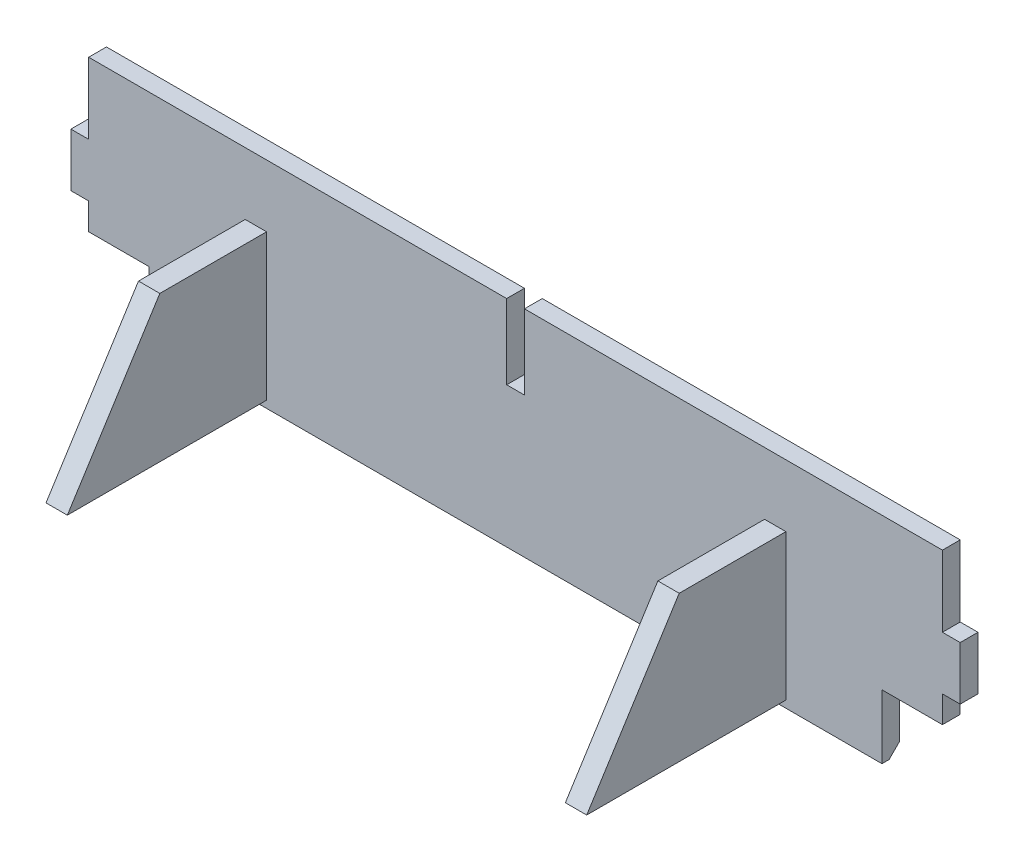
ISO-10303-21;
HEADER;
FILE_DESCRIPTION(('STEP AP214'),'2;1');
FILE_NAME('part.step','',(''),(''),'','','');
FILE_SCHEMA(('AUTOMOTIVE_DESIGN { 1 0 10303 214 1 1 1 1 }'));
ENDSEC;
DATA;
#1=APPLICATION_CONTEXT('core data for automotive mechanical design processes');
#2=APPLICATION_PROTOCOL_DEFINITION('international standard','automotive_design',2000,#1);
#3=PRODUCT_CONTEXT('',#1,'mechanical');
#4=PRODUCT('Part','Part','',(#3));
#5=PRODUCT_RELATED_PRODUCT_CATEGORY('part','',(#4));
#6=PRODUCT_DEFINITION_FORMATION('','',#4);
#7=PRODUCT_DEFINITION_CONTEXT('part definition',#1,'design');
#8=PRODUCT_DEFINITION('design','',#6,#7);
#9=PRODUCT_DEFINITION_SHAPE('','',#8);
#10=(LENGTH_UNIT() NAMED_UNIT(*) SI_UNIT(.MILLI.,.METRE.));
#11=(NAMED_UNIT(*) PLANE_ANGLE_UNIT() SI_UNIT($,.RADIAN.));
#12=(NAMED_UNIT(*) SI_UNIT($,.STERADIAN.) SOLID_ANGLE_UNIT());
#13=UNCERTAINTY_MEASURE_WITH_UNIT(LENGTH_MEASURE(1.E-05),#10,'distance_accuracy_value','');
#14=(GEOMETRIC_REPRESENTATION_CONTEXT(3) GLOBAL_UNCERTAINTY_ASSIGNED_CONTEXT((#13)) GLOBAL_UNIT_ASSIGNED_CONTEXT((#10,
#11,#12)) REPRESENTATION_CONTEXT('',''));
#15=CARTESIAN_POINT('',(0.,0.,0.));
#16=DIRECTION('',(0.,0.,1.));
#17=DIRECTION('',(1.,0.,0.));
#18=AXIS2_PLACEMENT_3D('',#15,#16,#17);
#19=CARTESIAN_POINT('',(0.,0.,5.));
#20=DIRECTION('',(0.,0.,1.));
#21=DIRECTION('',(1.,0.,0.));
#22=AXIS2_PLACEMENT_3D('',#19,#20,#21);
#23=PLANE('',#22);
#24=DIRECTION('',(1.,0.,0.));
#25=VECTOR('',#24,1.);
#26=CARTESIAN_POINT('',(0.,0.,5.));
#27=LINE('',#26,#25);
#28=CARTESIAN_POINT('',(17.,0.,5.));
#29=VERTEX_POINT('',#28);
#30=CARTESIAN_POINT('',(223.,0.,5.));
#31=VERTEX_POINT('',#30);
#32=EDGE_CURVE('E348',#29,#31,#27,.T.);
#33=ORIENTED_EDGE('',*,*,#32,.T.);
#34=DIRECTION('',(0.,1.,0.));
#35=VECTOR('',#34,1.);
#36=CARTESIAN_POINT('',(223.,0.,5.));
#37=LINE('',#36,#35);
#38=CARTESIAN_POINT('',(223.,18.,5.));
#39=VERTEX_POINT('',#38);
#40=EDGE_CURVE('E304',#31,#39,#37,.T.);
#41=ORIENTED_EDGE('',*,*,#40,.T.);
#42=DIRECTION('',(-1.,0.,0.));
#43=VECTOR('',#42,1.);
#44=CARTESIAN_POINT('',(0.,18.,5.));
#45=LINE('',#44,#43);
#46=CARTESIAN_POINT('',(240.,18.,5.));
#47=VERTEX_POINT('',#46);
#48=EDGE_CURVE('E299',#47,#39,#45,.T.);
#49=ORIENTED_EDGE('',*,*,#48,.F.);
#50=DIRECTION('',(0.,1.,0.));
#51=VECTOR('',#50,1.);
#52=CARTESIAN_POINT('',(240.,0.,5.));
#53=LINE('',#52,#51);
#54=CARTESIAN_POINT('',(240.,25.5,5.));
#55=VERTEX_POINT('',#54);
#56=EDGE_CURVE('E353',#47,#55,#53,.T.);
#57=ORIENTED_EDGE('',*,*,#56,.T.);
#58=DIRECTION('',(1.,0.,0.));
#59=VECTOR('',#58,1.);
#60=CARTESIAN_POINT('',(240.,25.5,5.));
#61=LINE('',#60,#59);
#62=CARTESIAN_POINT('',(245.,25.5,5.));
#63=VERTEX_POINT('',#62);
#64=EDGE_CURVE('E356',#55,#63,#61,.T.);
#65=ORIENTED_EDGE('',*,*,#64,.T.);
#66=DIRECTION('',(0.,1.,0.));
#67=VECTOR('',#66,1.);
#68=CARTESIAN_POINT('',(245.,25.5,5.));
#69=LINE('',#68,#67);
#70=CARTESIAN_POINT('',(245.,40.5,5.));
#71=VERTEX_POINT('',#70);
#72=EDGE_CURVE('E359',#63,#71,#69,.T.);
#73=ORIENTED_EDGE('',*,*,#72,.T.);
#74=DIRECTION('',(-1.,0.,0.));
#75=VECTOR('',#74,1.);
#76=CARTESIAN_POINT('',(245.,40.5,5.));
#77=LINE('',#76,#75);
#78=CARTESIAN_POINT('',(240.,40.5,5.));
#79=VERTEX_POINT('',#78);
#80=EDGE_CURVE('E362',#71,#79,#77,.T.);
#81=ORIENTED_EDGE('',*,*,#80,.T.);
#82=DIRECTION('',(0.,1.,0.));
#83=VECTOR('',#82,1.);
#84=CARTESIAN_POINT('',(240.,40.5,5.));
#85=LINE('',#84,#83);
#86=CARTESIAN_POINT('',(240.,60.5,5.));
#87=VERTEX_POINT('',#86);
#88=EDGE_CURVE('E365',#79,#87,#85,.T.);
#89=ORIENTED_EDGE('',*,*,#88,.T.);
#90=DIRECTION('',(-1.,0.,0.));
#91=VECTOR('',#90,1.);
#92=CARTESIAN_POINT('',(122.5,60.5,5.));
#93=LINE('',#92,#91);
#94=CARTESIAN_POINT('',(122.5,60.5,5.));
#95=VERTEX_POINT('',#94);
#96=EDGE_CURVE('E368',#87,#95,#93,.T.);
#97=ORIENTED_EDGE('',*,*,#96,.T.);
#98=DIRECTION('',(0.,-1.,0.));
#99=VECTOR('',#98,1.);
#100=CARTESIAN_POINT('',(122.5,39.5,5.));
#101=LINE('',#100,#99);
#102=CARTESIAN_POINT('',(122.5,39.5,5.));
#103=VERTEX_POINT('',#102);
#104=EDGE_CURVE('E371',#95,#103,#101,.T.);
#105=ORIENTED_EDGE('',*,*,#104,.T.);
#106=DIRECTION('',(-1.,0.,0.));
#107=VECTOR('',#106,1.);
#108=CARTESIAN_POINT('',(117.5,39.5,5.));
#109=LINE('',#108,#107);
#110=CARTESIAN_POINT('',(117.5,39.5,5.));
#111=VERTEX_POINT('',#110);
#112=EDGE_CURVE('E374',#103,#111,#109,.T.);
#113=ORIENTED_EDGE('',*,*,#112,.T.);
#114=DIRECTION('',(0.,1.,0.));
#115=VECTOR('',#114,1.);
#116=CARTESIAN_POINT('',(117.5,60.5,5.));
#117=LINE('',#116,#115);
#118=CARTESIAN_POINT('',(117.5,60.5,5.));
#119=VERTEX_POINT('',#118);
#120=EDGE_CURVE('E377',#111,#119,#117,.T.);
#121=ORIENTED_EDGE('',*,*,#120,.T.);
#122=DIRECTION('',(-1.,0.,0.));
#123=VECTOR('',#122,1.);
#124=CARTESIAN_POINT('',(0.,60.5,5.));
#125=LINE('',#124,#123);
#126=CARTESIAN_POINT('',(0.,60.5,5.));
#127=VERTEX_POINT('',#126);
#128=EDGE_CURVE('E380',#119,#127,#125,.T.);
#129=ORIENTED_EDGE('',*,*,#128,.T.);
#130=DIRECTION('',(0.,-1.,0.));
#131=VECTOR('',#130,1.);
#132=CARTESIAN_POINT('',(0.,60.5,5.));
#133=LINE('',#132,#131);
#134=CARTESIAN_POINT('',(0.,40.5,5.));
#135=VERTEX_POINT('',#134);
#136=EDGE_CURVE('E383',#127,#135,#133,.T.);
#137=ORIENTED_EDGE('',*,*,#136,.T.);
#138=DIRECTION('',(-1.,0.,0.));
#139=VECTOR('',#138,1.);
#140=CARTESIAN_POINT('',(0.,40.5,5.));
#141=LINE('',#140,#139);
#142=CARTESIAN_POINT('',(-5.,40.5,5.));
#143=VERTEX_POINT('',#142);
#144=EDGE_CURVE('E386',#135,#143,#141,.T.);
#145=ORIENTED_EDGE('',*,*,#144,.T.);
#146=DIRECTION('',(0.,-1.,0.));
#147=VECTOR('',#146,1.);
#148=CARTESIAN_POINT('',(-5.,40.5,5.));
#149=LINE('',#148,#147);
#150=CARTESIAN_POINT('',(-5.,25.5,5.));
#151=VERTEX_POINT('',#150);
#152=EDGE_CURVE('E389',#143,#151,#149,.T.);
#153=ORIENTED_EDGE('',*,*,#152,.T.);
#154=DIRECTION('',(1.,0.,0.));
#155=VECTOR('',#154,1.);
#156=CARTESIAN_POINT('',(-5.,25.5,5.));
#157=LINE('',#156,#155);
#158=CARTESIAN_POINT('',(0.,25.5,5.));
#159=VERTEX_POINT('',#158);
#160=EDGE_CURVE('E392',#151,#159,#157,.T.);
#161=ORIENTED_EDGE('',*,*,#160,.T.);
#162=DIRECTION('',(0.,-1.,0.));
#163=VECTOR('',#162,1.);
#164=CARTESIAN_POINT('',(0.,25.5,5.));
#165=LINE('',#164,#163);
#166=CARTESIAN_POINT('',(0.,18.,5.));
#167=VERTEX_POINT('',#166);
#168=EDGE_CURVE('E344',#159,#167,#165,.T.);
#169=ORIENTED_EDGE('',*,*,#168,.T.);
#170=DIRECTION('',(1.,0.,0.));
#171=VECTOR('',#170,1.);
#172=CARTESIAN_POINT('',(0.,18.,5.));
#173=LINE('',#172,#171);
#174=CARTESIAN_POINT('',(17.,18.,5.));
#175=VERTEX_POINT('',#174);
#176=EDGE_CURVE('E308',#167,#175,#173,.T.);
#177=ORIENTED_EDGE('',*,*,#176,.T.);
#178=DIRECTION('',(0.,1.,0.));
#179=VECTOR('',#178,1.);
#180=CARTESIAN_POINT('',(17.,0.,5.));
#181=LINE('',#180,#179);
#182=EDGE_CURVE('E331',#29,#175,#181,.T.);
#183=ORIENTED_EDGE('',*,*,#182,.F.);
#184=EDGE_LOOP('',(#33,#41,#49,#57,#65,#73,#81,#89,#97,#105,#113,#121,#129,#137,#145,#153,#161,
#169,#177,#183));
#185=FACE_BOUND('',#184,.T.);
#186=DIRECTION('',(-1.,0.,0.));
#187=VECTOR('',#186,1.);
#188=CARTESIAN_POINT('',(190.,43.,5.));
#189=LINE('',#188,#187);
#190=CARTESIAN_POINT('',(196.,43.,5.));
#191=VERTEX_POINT('',#190);
#192=CARTESIAN_POINT('',(190.,43.,5.));
#193=VERTEX_POINT('',#192);
#194=EDGE_CURVE('E266',#191,#193,#189,.T.);
#195=ORIENTED_EDGE('',*,*,#194,.F.);
#196=DIRECTION('',(0.,1.,0.));
#197=VECTOR('',#196,1.);
#198=CARTESIAN_POINT('',(196.,2.,5.));
#199=LINE('',#198,#197);
#200=CARTESIAN_POINT('',(196.,2.,5.));
#201=VERTEX_POINT('',#200);
#202=EDGE_CURVE('E259',#201,#191,#199,.T.);
#203=ORIENTED_EDGE('',*,*,#202,.F.);
#204=DIRECTION('',(1.,0.,0.));
#205=VECTOR('',#204,1.);
#206=CARTESIAN_POINT('',(190.,2.,5.));
#207=LINE('',#206,#205);
#208=CARTESIAN_POINT('',(190.,2.,5.));
#209=VERTEX_POINT('',#208);
#210=EDGE_CURVE('E279',#209,#201,#207,.T.);
#211=ORIENTED_EDGE('',*,*,#210,.F.);
#212=DIRECTION('',(0.,-1.,0.));
#213=VECTOR('',#212,1.);
#214=CARTESIAN_POINT('',(190.,2.,5.));
#215=LINE('',#214,#213);
#216=EDGE_CURVE('E275',#193,#209,#215,.T.);
#217=ORIENTED_EDGE('',*,*,#216,.F.);
#218=EDGE_LOOP('',(#195,#203,#211,#217));
#219=FACE_BOUND('',#218,.T.);
#220=DIRECTION('',(1.,0.,0.));
#221=VECTOR('',#220,1.);
#222=CARTESIAN_POINT('',(50.,2.,5.));
#223=LINE('',#222,#221);
#224=CARTESIAN_POINT('',(44.,2.,5.));
#225=VERTEX_POINT('',#224);
#226=CARTESIAN_POINT('',(50.,2.,5.));
#227=VERTEX_POINT('',#226);
#228=EDGE_CURVE('E646',#225,#227,#223,.T.);
#229=ORIENTED_EDGE('',*,*,#228,.F.);
#230=DIRECTION('',(0.,-1.,0.));
#231=VECTOR('',#230,1.);
#232=CARTESIAN_POINT('',(44.,2.,5.));
#233=LINE('',#232,#231);
#234=CARTESIAN_POINT('',(44.,43.,5.));
#235=VERTEX_POINT('',#234);
#236=EDGE_CURVE('E256',#235,#225,#233,.T.);
#237=ORIENTED_EDGE('',*,*,#236,.F.);
#238=DIRECTION('',(-1.,0.,0.));
#239=VECTOR('',#238,1.);
#240=CARTESIAN_POINT('',(44.,43.,5.));
#241=LINE('',#240,#239);
#242=CARTESIAN_POINT('',(50.,43.,5.));
#243=VERTEX_POINT('',#242);
#244=EDGE_CURVE('E653',#243,#235,#241,.T.);
#245=ORIENTED_EDGE('',*,*,#244,.F.);
#246=DIRECTION('',(0.,1.,0.));
#247=VECTOR('',#246,1.);
#248=CARTESIAN_POINT('',(50.,43.,5.));
#249=LINE('',#248,#247);
#250=EDGE_CURVE('E649',#227,#243,#249,.T.);
#251=ORIENTED_EDGE('',*,*,#250,.F.);
#252=EDGE_LOOP('',(#229,#237,#245,#251));
#253=FACE_BOUND('',#252,.T.);
#254=ADVANCED_FACE('F42',(#185,#219,#253),#23,.T.);
#255=CARTESIAN_POINT('',(0.,25.5,5.));
#256=DIRECTION('',(1.,0.,0.));
#257=DIRECTION('',(0.,0.,-1.));
#258=AXIS2_PLACEMENT_3D('',#255,#256,#257);
#259=PLANE('',#258);
#260=DIRECTION('',(0.,0.,1.));
#261=VECTOR('',#260,1.);
#262=CARTESIAN_POINT('',(0.,18.,0.));
#263=LINE('',#262,#261);
#264=CARTESIAN_POINT('',(0.,18.,0.));
#265=VERTEX_POINT('',#264);
#266=EDGE_CURVE('E294',#265,#167,#263,.T.);
#267=ORIENTED_EDGE('',*,*,#266,.T.);
#268=ORIENTED_EDGE('',*,*,#168,.F.);
#269=DIRECTION('',(0.,0.,-1.));
#270=VECTOR('',#269,1.);
#271=CARTESIAN_POINT('',(0.,25.5,5.));
#272=LINE('',#271,#270);
#273=CARTESIAN_POINT('',(0.,25.5,0.));
#274=VERTEX_POINT('',#273);
#275=EDGE_CURVE('E395',#159,#274,#272,.T.);
#276=ORIENTED_EDGE('',*,*,#275,.T.);
#277=DIRECTION('',(0.,-1.,0.));
#278=VECTOR('',#277,1.);
#279=CARTESIAN_POINT('',(0.,25.5,0.));
#280=LINE('',#279,#278);
#281=EDGE_CURVE('E315',#274,#265,#280,.T.);
#282=ORIENTED_EDGE('',*,*,#281,.T.);
#283=EDGE_LOOP('',(#267,#268,#276,#282));
#284=FACE_BOUND('',#283,.T.);
#285=ADVANCED_FACE('F670',(#284),#259,.F.);
#286=CARTESIAN_POINT('',(0.,0.,5.));
#287=DIRECTION('',(0.,1.,0.));
#288=DIRECTION('',(0.,0.,1.));
#289=AXIS2_PLACEMENT_3D('',#286,#287,#288);
#290=PLANE('',#289);
#291=DIRECTION('',(0.,0.,1.));
#292=VECTOR('',#291,1.);
#293=CARTESIAN_POINT('',(17.,0.,0.));
#294=LINE('',#293,#292);
#295=CARTESIAN_POINT('',(17.,0.,2.99999999999998));
#296=VERTEX_POINT('',#295);
#297=EDGE_CURVE('E327',#296,#29,#294,.T.);
#298=ORIENTED_EDGE('',*,*,#297,.F.);
#299=DIRECTION('',(1.,0.,0.));
#300=VECTOR('',#299,1.);
#301=CARTESIAN_POINT('',(0.,0.,2.99999999999998));
#302=LINE('',#301,#300);
#303=CARTESIAN_POINT('',(223.,0.,2.99999999999998));
#304=VERTEX_POINT('',#303);
#305=EDGE_CURVE('E495',#296,#304,#302,.T.);
#306=ORIENTED_EDGE('',*,*,#305,.T.);
#307=DIRECTION('',(0.,0.,1.));
#308=VECTOR('',#307,1.);
#309=CARTESIAN_POINT('',(223.,0.,0.));
#310=LINE('',#309,#308);
#311=EDGE_CURVE('E303',#304,#31,#310,.T.);
#312=ORIENTED_EDGE('',*,*,#311,.T.);
#313=ORIENTED_EDGE('',*,*,#32,.F.);
#314=EDGE_LOOP('',(#298,#306,#312,#313));
#315=FACE_BOUND('',#314,.T.);
#316=ADVANCED_FACE('F676',(#315),#290,.F.);
#317=CARTESIAN_POINT('',(0.,0.,0.));
#318=DIRECTION('',(0.,0.,1.));
#319=DIRECTION('',(1.,0.,0.));
#320=AXIS2_PLACEMENT_3D('',#317,#318,#319);
#321=PLANE('',#320);
#322=DIRECTION('',(0.,1.,0.));
#323=VECTOR('',#322,1.);
#324=CARTESIAN_POINT('',(223.,0.,0.));
#325=LINE('',#324,#323);
#326=CARTESIAN_POINT('',(223.,3.,0.));
#327=VERTEX_POINT('',#326);
#328=CARTESIAN_POINT('',(223.,18.,0.));
#329=VERTEX_POINT('',#328);
#330=EDGE_CURVE('E295',#327,#329,#325,.T.);
#331=ORIENTED_EDGE('',*,*,#330,.F.);
#332=DIRECTION('',(-1.,0.,0.));
#333=VECTOR('',#332,1.);
#334=CARTESIAN_POINT('',(0.,3.,0.));
#335=LINE('',#334,#333);
#336=CARTESIAN_POINT('',(17.,3.,0.));
#337=VERTEX_POINT('',#336);
#338=EDGE_CURVE('E51',#327,#337,#335,.T.);
#339=ORIENTED_EDGE('',*,*,#338,.T.);
#340=DIRECTION('',(0.,1.,0.));
#341=VECTOR('',#340,1.);
#342=CARTESIAN_POINT('',(17.,0.,0.));
#343=LINE('',#342,#341);
#344=CARTESIAN_POINT('',(17.,18.,0.));
#345=VERTEX_POINT('',#344);
#346=EDGE_CURVE('E330',#337,#345,#343,.T.);
#347=ORIENTED_EDGE('',*,*,#346,.T.);
#348=DIRECTION('',(1.,0.,0.));
#349=VECTOR('',#348,1.);
#350=CARTESIAN_POINT('',(0.,18.,0.));
#351=LINE('',#350,#349);
#352=EDGE_CURVE('E335',#265,#345,#351,.T.);
#353=ORIENTED_EDGE('',*,*,#352,.F.);
#354=ORIENTED_EDGE('',*,*,#281,.F.);
#355=DIRECTION('',(1.,0.,0.));
#356=VECTOR('',#355,1.);
#357=CARTESIAN_POINT('',(-5.,25.5,0.));
#358=LINE('',#357,#356);
#359=CARTESIAN_POINT('',(-5.,25.5,0.));
#360=VERTEX_POINT('',#359);
#361=EDGE_CURVE('E349',#360,#274,#358,.T.);
#362=ORIENTED_EDGE('',*,*,#361,.F.);
#363=DIRECTION('',(0.,-1.,0.));
#364=VECTOR('',#363,1.);
#365=CARTESIAN_POINT('',(-5.,40.5,0.));
#366=LINE('',#365,#364);
#367=CARTESIAN_POINT('',(-5.,40.5,0.));
#368=VERTEX_POINT('',#367);
#369=EDGE_CURVE('E435',#368,#360,#366,.T.);
#370=ORIENTED_EDGE('',*,*,#369,.F.);
#371=DIRECTION('',(-1.,0.,0.));
#372=VECTOR('',#371,1.);
#373=CARTESIAN_POINT('',(0.,40.5,0.));
#374=LINE('',#373,#372);
#375=CARTESIAN_POINT('',(0.,40.5,0.));
#376=VERTEX_POINT('',#375);
#377=EDGE_CURVE('E432',#376,#368,#374,.T.);
#378=ORIENTED_EDGE('',*,*,#377,.F.);
#379=DIRECTION('',(0.,-1.,0.));
#380=VECTOR('',#379,1.);
#381=CARTESIAN_POINT('',(0.,60.5,0.));
#382=LINE('',#381,#380);
#383=CARTESIAN_POINT('',(0.,60.5,0.));
#384=VERTEX_POINT('',#383);
#385=EDGE_CURVE('E429',#384,#376,#382,.T.);
#386=ORIENTED_EDGE('',*,*,#385,.F.);
#387=DIRECTION('',(-1.,0.,0.));
#388=VECTOR('',#387,1.);
#389=CARTESIAN_POINT('',(0.,60.5,0.));
#390=LINE('',#389,#388);
#391=CARTESIAN_POINT('',(117.5,60.5,0.));
#392=VERTEX_POINT('',#391);
#393=EDGE_CURVE('E426',#392,#384,#390,.T.);
#394=ORIENTED_EDGE('',*,*,#393,.F.);
#395=DIRECTION('',(0.,1.,0.));
#396=VECTOR('',#395,1.);
#397=CARTESIAN_POINT('',(117.5,60.5,0.));
#398=LINE('',#397,#396);
#399=CARTESIAN_POINT('',(117.5,39.5,0.));
#400=VERTEX_POINT('',#399);
#401=EDGE_CURVE('E423',#400,#392,#398,.T.);
#402=ORIENTED_EDGE('',*,*,#401,.F.);
#403=DIRECTION('',(-1.,0.,0.));
#404=VECTOR('',#403,1.);
#405=CARTESIAN_POINT('',(117.5,39.5,0.));
#406=LINE('',#405,#404);
#407=CARTESIAN_POINT('',(122.5,39.5,0.));
#408=VERTEX_POINT('',#407);
#409=EDGE_CURVE('E420',#408,#400,#406,.T.);
#410=ORIENTED_EDGE('',*,*,#409,.F.);
#411=DIRECTION('',(0.,-1.,0.));
#412=VECTOR('',#411,1.);
#413=CARTESIAN_POINT('',(122.5,39.5,0.));
#414=LINE('',#413,#412);
#415=CARTESIAN_POINT('',(122.5,60.5,0.));
#416=VERTEX_POINT('',#415);
#417=EDGE_CURVE('E417',#416,#408,#414,.T.);
#418=ORIENTED_EDGE('',*,*,#417,.F.);
#419=DIRECTION('',(-1.,0.,0.));
#420=VECTOR('',#419,1.);
#421=CARTESIAN_POINT('',(122.5,60.5,0.));
#422=LINE('',#421,#420);
#423=CARTESIAN_POINT('',(240.,60.5,0.));
#424=VERTEX_POINT('',#423);
#425=EDGE_CURVE('E414',#424,#416,#422,.T.);
#426=ORIENTED_EDGE('',*,*,#425,.F.);
#427=DIRECTION('',(0.,1.,0.));
#428=VECTOR('',#427,1.);
#429=CARTESIAN_POINT('',(240.,40.5,0.));
#430=LINE('',#429,#428);
#431=CARTESIAN_POINT('',(240.,40.5,0.));
#432=VERTEX_POINT('',#431);
#433=EDGE_CURVE('E411',#432,#424,#430,.T.);
#434=ORIENTED_EDGE('',*,*,#433,.F.);
#435=DIRECTION('',(-1.,0.,0.));
#436=VECTOR('',#435,1.);
#437=CARTESIAN_POINT('',(245.,40.5,0.));
#438=LINE('',#437,#436);
#439=CARTESIAN_POINT('',(245.,40.5,0.));
#440=VERTEX_POINT('',#439);
#441=EDGE_CURVE('E408',#440,#432,#438,.T.);
#442=ORIENTED_EDGE('',*,*,#441,.F.);
#443=DIRECTION('',(0.,1.,0.));
#444=VECTOR('',#443,1.);
#445=CARTESIAN_POINT('',(245.,25.5,0.));
#446=LINE('',#445,#444);
#447=CARTESIAN_POINT('',(245.,25.5,0.));
#448=VERTEX_POINT('',#447);
#449=EDGE_CURVE('E405',#448,#440,#446,.T.);
#450=ORIENTED_EDGE('',*,*,#449,.F.);
#451=DIRECTION('',(1.,0.,0.));
#452=VECTOR('',#451,1.);
#453=CARTESIAN_POINT('',(240.,25.5,0.));
#454=LINE('',#453,#452);
#455=CARTESIAN_POINT('',(240.,25.5,0.));
#456=VERTEX_POINT('',#455);
#457=EDGE_CURVE('E402',#456,#448,#454,.T.);
#458=ORIENTED_EDGE('',*,*,#457,.F.);
#459=DIRECTION('',(0.,1.,0.));
#460=VECTOR('',#459,1.);
#461=CARTESIAN_POINT('',(240.,0.,0.));
#462=LINE('',#461,#460);
#463=CARTESIAN_POINT('',(240.,18.,0.));
#464=VERTEX_POINT('',#463);
#465=EDGE_CURVE('E399',#464,#456,#462,.T.);
#466=ORIENTED_EDGE('',*,*,#465,.F.);
#467=DIRECTION('',(-1.,0.,0.));
#468=VECTOR('',#467,1.);
#469=CARTESIAN_POINT('',(0.,18.,0.));
#470=LINE('',#469,#468);
#471=EDGE_CURVE('E298',#464,#329,#470,.T.);
#472=ORIENTED_EDGE('',*,*,#471,.T.);
#473=EDGE_LOOP('',(#331,#339,#347,#353,#354,#362,#370,#378,#386,#394,#402,#410,#418,#426,#434,
#442,#450,#458,#466,#472));
#474=FACE_BOUND('',#473,.T.);
#475=ADVANCED_FACE('F683',(#474),#321,.F.);
#476=CARTESIAN_POINT('',(240.,0.,5.));
#477=DIRECTION('',(-1.,0.,0.));
#478=DIRECTION('',(0.,0.,1.));
#479=AXIS2_PLACEMENT_3D('',#476,#477,#478);
#480=PLANE('',#479);
#481=ORIENTED_EDGE('',*,*,#56,.F.);
#482=DIRECTION('',(0.,0.,1.));
#483=VECTOR('',#482,1.);
#484=CARTESIAN_POINT('',(240.,18.,0.));
#485=LINE('',#484,#483);
#486=EDGE_CURVE('E316',#464,#47,#485,.T.);
#487=ORIENTED_EDGE('',*,*,#486,.F.);
#488=ORIENTED_EDGE('',*,*,#465,.T.);
#489=DIRECTION('',(0.,0.,-1.));
#490=VECTOR('',#489,1.);
#491=CARTESIAN_POINT('',(240.,25.5,5.));
#492=LINE('',#491,#490);
#493=EDGE_CURVE('E491',#55,#456,#492,.T.);
#494=ORIENTED_EDGE('',*,*,#493,.F.);
#495=EDGE_LOOP('',(#481,#487,#488,#494));
#496=FACE_BOUND('',#495,.T.);
#497=ADVANCED_FACE('F686',(#496),#480,.F.);
#498=CARTESIAN_POINT('',(240.,25.5,5.));
#499=DIRECTION('',(0.,1.,0.));
#500=DIRECTION('',(-1.,0.,0.));
#501=AXIS2_PLACEMENT_3D('',#498,#499,#500);
#502=PLANE('',#501);
#503=ORIENTED_EDGE('',*,*,#457,.T.);
#504=DIRECTION('',(0.,0.,-1.));
#505=VECTOR('',#504,1.);
#506=CARTESIAN_POINT('',(245.,25.5,5.));
#507=LINE('',#506,#505);
#508=EDGE_CURVE('E487',#63,#448,#507,.T.);
#509=ORIENTED_EDGE('',*,*,#508,.F.);
#510=ORIENTED_EDGE('',*,*,#64,.F.);
#511=ORIENTED_EDGE('',*,*,#493,.T.);
#512=EDGE_LOOP('',(#503,#509,#510,#511));
#513=FACE_BOUND('',#512,.T.);
#514=ADVANCED_FACE('F735',(#513),#502,.F.);
#515=CARTESIAN_POINT('',(245.,25.5,5.));
#516=DIRECTION('',(-1.,0.,0.));
#517=DIRECTION('',(0.,0.,1.));
#518=AXIS2_PLACEMENT_3D('',#515,#516,#517);
#519=PLANE('',#518);
#520=ORIENTED_EDGE('',*,*,#449,.T.);
#521=DIRECTION('',(0.,0.,-1.));
#522=VECTOR('',#521,1.);
#523=CARTESIAN_POINT('',(245.,40.5,5.));
#524=LINE('',#523,#522);
#525=EDGE_CURVE('E483',#71,#440,#524,.T.);
#526=ORIENTED_EDGE('',*,*,#525,.F.);
#527=ORIENTED_EDGE('',*,*,#72,.F.);
#528=ORIENTED_EDGE('',*,*,#508,.T.);
#529=EDGE_LOOP('',(#520,#526,#527,#528));
#530=FACE_BOUND('',#529,.T.);
#531=ADVANCED_FACE('F731',(#530),#519,.F.);
#532=CARTESIAN_POINT('',(245.,40.5,5.));
#533=DIRECTION('',(0.,-1.,0.));
#534=DIRECTION('',(0.,0.,-1.));
#535=AXIS2_PLACEMENT_3D('',#532,#533,#534);
#536=PLANE('',#535);
#537=ORIENTED_EDGE('',*,*,#441,.T.);
#538=DIRECTION('',(0.,0.,-1.));
#539=VECTOR('',#538,1.);
#540=CARTESIAN_POINT('',(240.,40.5,5.));
#541=LINE('',#540,#539);
#542=EDGE_CURVE('E479',#79,#432,#541,.T.);
#543=ORIENTED_EDGE('',*,*,#542,.F.);
#544=ORIENTED_EDGE('',*,*,#80,.F.);
#545=ORIENTED_EDGE('',*,*,#525,.T.);
#546=EDGE_LOOP('',(#537,#543,#544,#545));
#547=FACE_BOUND('',#546,.T.);
#548=ADVANCED_FACE('F727',(#547),#536,.F.);
#549=CARTESIAN_POINT('',(240.,40.5,5.));
#550=DIRECTION('',(-1.,0.,0.));
#551=DIRECTION('',(0.,0.,1.));
#552=AXIS2_PLACEMENT_3D('',#549,#550,#551);
#553=PLANE('',#552);
#554=ORIENTED_EDGE('',*,*,#433,.T.);
#555=DIRECTION('',(0.,0.,-1.));
#556=VECTOR('',#555,1.);
#557=CARTESIAN_POINT('',(240.,60.5,5.));
#558=LINE('',#557,#556);
#559=EDGE_CURVE('E475',#87,#424,#558,.T.);
#560=ORIENTED_EDGE('',*,*,#559,.F.);
#561=ORIENTED_EDGE('',*,*,#88,.F.);
#562=ORIENTED_EDGE('',*,*,#542,.T.);
#563=EDGE_LOOP('',(#554,#560,#561,#562));
#564=FACE_BOUND('',#563,.T.);
#565=ADVANCED_FACE('F723',(#564),#553,.F.);
#566=CARTESIAN_POINT('',(122.5,60.5,5.));
#567=DIRECTION('',(0.,-1.,0.));
#568=DIRECTION('',(0.,0.,-1.));
#569=AXIS2_PLACEMENT_3D('',#566,#567,#568);
#570=PLANE('',#569);
#571=ORIENTED_EDGE('',*,*,#425,.T.);
#572=DIRECTION('',(0.,0.,-1.));
#573=VECTOR('',#572,1.);
#574=CARTESIAN_POINT('',(122.5,60.5,5.));
#575=LINE('',#574,#573);
#576=EDGE_CURVE('E471',#95,#416,#575,.T.);
#577=ORIENTED_EDGE('',*,*,#576,.F.);
#578=ORIENTED_EDGE('',*,*,#96,.F.);
#579=ORIENTED_EDGE('',*,*,#559,.T.);
#580=EDGE_LOOP('',(#571,#577,#578,#579));
#581=FACE_BOUND('',#580,.T.);
#582=ADVANCED_FACE('F719',(#581),#570,.F.);
#583=CARTESIAN_POINT('',(122.5,39.5,5.));
#584=DIRECTION('',(1.,0.,0.));
#585=DIRECTION('',(0.,1.,0.));
#586=AXIS2_PLACEMENT_3D('',#583,#584,#585);
#587=PLANE('',#586);
#588=ORIENTED_EDGE('',*,*,#417,.T.);
#589=DIRECTION('',(0.,0.,-1.));
#590=VECTOR('',#589,1.);
#591=CARTESIAN_POINT('',(122.5,39.5,5.));
#592=LINE('',#591,#590);
#593=EDGE_CURVE('E467',#103,#408,#592,.T.);
#594=ORIENTED_EDGE('',*,*,#593,.F.);
#595=ORIENTED_EDGE('',*,*,#104,.F.);
#596=ORIENTED_EDGE('',*,*,#576,.T.);
#597=EDGE_LOOP('',(#588,#594,#595,#596));
#598=FACE_BOUND('',#597,.T.);
#599=ADVANCED_FACE('F715',(#598),#587,.F.);
#600=CARTESIAN_POINT('',(117.5,39.5,5.));
#601=DIRECTION('',(0.,-1.,0.));
#602=DIRECTION('',(1.,0.,0.));
#603=AXIS2_PLACEMENT_3D('',#600,#601,#602);
#604=PLANE('',#603);
#605=ORIENTED_EDGE('',*,*,#409,.T.);
#606=DIRECTION('',(0.,0.,-1.));
#607=VECTOR('',#606,1.);
#608=CARTESIAN_POINT('',(117.5,39.5,5.));
#609=LINE('',#608,#607);
#610=EDGE_CURVE('E463',#111,#400,#609,.T.);
#611=ORIENTED_EDGE('',*,*,#610,.F.);
#612=ORIENTED_EDGE('',*,*,#112,.F.);
#613=ORIENTED_EDGE('',*,*,#593,.T.);
#614=EDGE_LOOP('',(#605,#611,#612,#613));
#615=FACE_BOUND('',#614,.T.);
#616=ADVANCED_FACE('F711',(#615),#604,.F.);
#617=CARTESIAN_POINT('',(117.5,60.5,5.));
#618=DIRECTION('',(-1.,0.,0.));
#619=DIRECTION('',(0.,-1.,0.));
#620=AXIS2_PLACEMENT_3D('',#617,#618,#619);
#621=PLANE('',#620);
#622=ORIENTED_EDGE('',*,*,#401,.T.);
#623=DIRECTION('',(0.,0.,-1.));
#624=VECTOR('',#623,1.);
#625=CARTESIAN_POINT('',(117.5,60.5,5.));
#626=LINE('',#625,#624);
#627=EDGE_CURVE('E459',#119,#392,#626,.T.);
#628=ORIENTED_EDGE('',*,*,#627,.F.);
#629=ORIENTED_EDGE('',*,*,#120,.F.);
#630=ORIENTED_EDGE('',*,*,#610,.T.);
#631=EDGE_LOOP('',(#622,#628,#629,#630));
#632=FACE_BOUND('',#631,.T.);
#633=ADVANCED_FACE('F707',(#632),#621,.F.);
#634=CARTESIAN_POINT('',(0.,60.5,5.));
#635=DIRECTION('',(0.,-1.,0.));
#636=DIRECTION('',(0.,0.,-1.));
#637=AXIS2_PLACEMENT_3D('',#634,#635,#636);
#638=PLANE('',#637);
#639=ORIENTED_EDGE('',*,*,#393,.T.);
#640=DIRECTION('',(0.,0.,-1.));
#641=VECTOR('',#640,1.);
#642=CARTESIAN_POINT('',(0.,60.5,5.));
#643=LINE('',#642,#641);
#644=EDGE_CURVE('E455',#127,#384,#643,.T.);
#645=ORIENTED_EDGE('',*,*,#644,.F.);
#646=ORIENTED_EDGE('',*,*,#128,.F.);
#647=ORIENTED_EDGE('',*,*,#627,.T.);
#648=EDGE_LOOP('',(#639,#645,#646,#647));
#649=FACE_BOUND('',#648,.T.);
#650=ADVANCED_FACE('F703',(#649),#638,.F.);
#651=CARTESIAN_POINT('',(0.,60.5,5.));
#652=DIRECTION('',(1.,0.,0.));
#653=DIRECTION('',(0.,1.,0.));
#654=AXIS2_PLACEMENT_3D('',#651,#652,#653);
#655=PLANE('',#654);
#656=ORIENTED_EDGE('',*,*,#385,.T.);
#657=DIRECTION('',(0.,0.,-1.));
#658=VECTOR('',#657,1.);
#659=CARTESIAN_POINT('',(0.,40.5,5.));
#660=LINE('',#659,#658);
#661=EDGE_CURVE('E451',#135,#376,#660,.T.);
#662=ORIENTED_EDGE('',*,*,#661,.F.);
#663=ORIENTED_EDGE('',*,*,#136,.F.);
#664=ORIENTED_EDGE('',*,*,#644,.T.);
#665=EDGE_LOOP('',(#656,#662,#663,#664));
#666=FACE_BOUND('',#665,.T.);
#667=ADVANCED_FACE('F699',(#666),#655,.F.);
#668=CARTESIAN_POINT('',(0.,40.5,5.));
#669=DIRECTION('',(0.,-1.,0.));
#670=DIRECTION('',(1.,0.,0.));
#671=AXIS2_PLACEMENT_3D('',#668,#669,#670);
#672=PLANE('',#671);
#673=ORIENTED_EDGE('',*,*,#377,.T.);
#674=DIRECTION('',(0.,0.,-1.));
#675=VECTOR('',#674,1.);
#676=CARTESIAN_POINT('',(-5.,40.5,5.));
#677=LINE('',#676,#675);
#678=EDGE_CURVE('E447',#143,#368,#677,.T.);
#679=ORIENTED_EDGE('',*,*,#678,.F.);
#680=ORIENTED_EDGE('',*,*,#144,.F.);
#681=ORIENTED_EDGE('',*,*,#661,.T.);
#682=EDGE_LOOP('',(#673,#679,#680,#681));
#683=FACE_BOUND('',#682,.T.);
#684=ADVANCED_FACE('F695',(#683),#672,.F.);
#685=CARTESIAN_POINT('',(-5.,40.5,5.));
#686=DIRECTION('',(1.,0.,0.));
#687=DIRECTION('',(0.,1.,0.));
#688=AXIS2_PLACEMENT_3D('',#685,#686,#687);
#689=PLANE('',#688);
#690=ORIENTED_EDGE('',*,*,#369,.T.);
#691=DIRECTION('',(0.,0.,-1.));
#692=VECTOR('',#691,1.);
#693=CARTESIAN_POINT('',(-5.,25.5,5.));
#694=LINE('',#693,#692);
#695=EDGE_CURVE('E443',#151,#360,#694,.T.);
#696=ORIENTED_EDGE('',*,*,#695,.F.);
#697=ORIENTED_EDGE('',*,*,#152,.F.);
#698=ORIENTED_EDGE('',*,*,#678,.T.);
#699=EDGE_LOOP('',(#690,#696,#697,#698));
#700=FACE_BOUND('',#699,.T.);
#701=ADVANCED_FACE('F691',(#700),#689,.F.);
#702=CARTESIAN_POINT('',(-5.,25.5,5.));
#703=DIRECTION('',(0.,1.,0.));
#704=DIRECTION('',(0.,0.,1.));
#705=AXIS2_PLACEMENT_3D('',#702,#703,#704);
#706=PLANE('',#705);
#707=ORIENTED_EDGE('',*,*,#361,.T.);
#708=ORIENTED_EDGE('',*,*,#275,.F.);
#709=ORIENTED_EDGE('',*,*,#160,.F.);
#710=ORIENTED_EDGE('',*,*,#695,.T.);
#711=EDGE_LOOP('',(#707,#708,#709,#710));
#712=FACE_BOUND('',#711,.T.);
#713=ADVANCED_FACE('F687',(#712),#706,.F.);
#714=CARTESIAN_POINT('',(0.,18.,0.));
#715=DIRECTION('',(0.,-1.,0.));
#716=DIRECTION('',(0.,0.,-1.));
#717=AXIS2_PLACEMENT_3D('',#714,#715,#716);
#718=PLANE('',#717);
#719=ORIENTED_EDGE('',*,*,#176,.F.);
#720=ORIENTED_EDGE('',*,*,#266,.F.);
#721=ORIENTED_EDGE('',*,*,#352,.T.);
#722=DIRECTION('',(0.,0.,1.));
#723=VECTOR('',#722,1.);
#724=CARTESIAN_POINT('',(17.,18.,0.));
#725=LINE('',#724,#723);
#726=EDGE_CURVE('E324',#345,#175,#725,.T.);
#727=ORIENTED_EDGE('',*,*,#726,.T.);
#728=EDGE_LOOP('',(#719,#720,#721,#727));
#729=FACE_BOUND('',#728,.T.);
#730=ADVANCED_FACE('F690',(#729),#718,.T.);
#731=CARTESIAN_POINT('',(17.,0.,0.));
#732=DIRECTION('',(1.,0.,0.));
#733=DIRECTION('',(0.,0.,-1.));
#734=AXIS2_PLACEMENT_3D('',#731,#732,#733);
#735=PLANE('',#734);
#736=ORIENTED_EDGE('',*,*,#346,.F.);
#737=DIRECTION('',(0.,0.707106781186551,-0.707106781186544));
#738=VECTOR('',#737,1.);
#739=CARTESIAN_POINT('',(17.,0.,2.99999999999998));
#740=LINE('',#739,#738);
#741=EDGE_CURVE('E11',#337,#296,#740,.F.);
#742=ORIENTED_EDGE('',*,*,#741,.T.);
#743=ORIENTED_EDGE('',*,*,#297,.T.);
#744=ORIENTED_EDGE('',*,*,#182,.T.);
#745=ORIENTED_EDGE('',*,*,#726,.F.);
#746=EDGE_LOOP('',(#736,#742,#743,#744,#745));
#747=FACE_BOUND('',#746,.T.);
#748=ADVANCED_FACE('F681',(#747),#735,.F.);
#749=CARTESIAN_POINT('',(223.,0.,0.));
#750=DIRECTION('',(1.,0.,0.));
#751=DIRECTION('',(0.,0.,-1.));
#752=AXIS2_PLACEMENT_3D('',#749,#750,#751);
#753=PLANE('',#752);
#754=ORIENTED_EDGE('',*,*,#311,.F.);
#755=DIRECTION('',(0.,-0.707106781186551,0.707106781186544));
#756=VECTOR('',#755,1.);
#757=CARTESIAN_POINT('',(223.,1.49999999999999,1.5));
#758=LINE('',#757,#756);
#759=EDGE_CURVE('E65',#304,#327,#758,.F.);
#760=ORIENTED_EDGE('',*,*,#759,.T.);
#761=ORIENTED_EDGE('',*,*,#330,.T.);
#762=DIRECTION('',(0.,0.,1.));
#763=VECTOR('',#762,1.);
#764=CARTESIAN_POINT('',(223.,18.,0.));
#765=LINE('',#764,#763);
#766=EDGE_CURVE('E312',#329,#39,#765,.T.);
#767=ORIENTED_EDGE('',*,*,#766,.T.);
#768=ORIENTED_EDGE('',*,*,#40,.F.);
#769=EDGE_LOOP('',(#754,#760,#761,#767,#768));
#770=FACE_BOUND('',#769,.T.);
#771=ADVANCED_FACE('F807',(#770),#753,.T.);
#772=CARTESIAN_POINT('',(0.,18.,0.));
#773=DIRECTION('',(0.,1.,0.));
#774=DIRECTION('',(-1.,0.,0.));
#775=AXIS2_PLACEMENT_3D('',#772,#773,#774);
#776=PLANE('',#775);
#777=ORIENTED_EDGE('',*,*,#48,.T.);
#778=ORIENTED_EDGE('',*,*,#766,.F.);
#779=ORIENTED_EDGE('',*,*,#471,.F.);
#780=ORIENTED_EDGE('',*,*,#486,.T.);
#781=EDGE_LOOP('',(#777,#778,#779,#780));
#782=FACE_BOUND('',#781,.T.);
#783=ADVANCED_FACE('F804',(#782),#776,.F.);
#784=CARTESIAN_POINT('',(196.,2.,75.));
#785=DIRECTION('',(-1.,0.,0.));
#786=DIRECTION('',(0.,0.,1.));
#787=AXIS2_PLACEMENT_3D('',#784,#785,#786);
#788=PLANE('',#787);
#789=DIRECTION('',(0.,0.,-1.));
#790=VECTOR('',#789,1.);
#791=CARTESIAN_POINT('',(196.,43.,75.));
#792=LINE('',#791,#790);
#793=CARTESIAN_POINT('',(196.,43.,35.));
#794=VERTEX_POINT('',#793);
#795=EDGE_CURVE('E291',#794,#191,#792,.T.);
#796=ORIENTED_EDGE('',*,*,#795,.F.);
#797=DIRECTION('',(0.,-0.844508578449678,0.535542025358332));
#798=VECTOR('',#797,1.);
#799=CARTESIAN_POINT('',(196.,-4.33177768349597,65.0152736529487));
#800=LINE('',#799,#798);
#801=CARTESIAN_POINT('',(196.,2.,61.));
#802=VERTEX_POINT('',#801);
#803=EDGE_CURVE('E640',#794,#802,#800,.T.);
#804=ORIENTED_EDGE('',*,*,#803,.T.);
#805=DIRECTION('',(0.,0.,-1.));
#806=VECTOR('',#805,1.);
#807=CARTESIAN_POINT('',(196.,2.,75.));
#808=LINE('',#807,#806);
#809=EDGE_CURVE('E283',#802,#201,#808,.T.);
#810=ORIENTED_EDGE('',*,*,#809,.T.);
#811=ORIENTED_EDGE('',*,*,#202,.T.);
#812=EDGE_LOOP('',(#796,#804,#810,#811));
#813=FACE_BOUND('',#812,.T.);
#814=ADVANCED_FACE('F814',(#813),#788,.F.);
#815=CARTESIAN_POINT('',(190.,43.,75.));
#816=DIRECTION('',(0.,-1.,0.));
#817=DIRECTION('',(0.,0.,-1.));
#818=AXIS2_PLACEMENT_3D('',#815,#816,#817);
#819=PLANE('',#818);
#820=DIRECTION('',(0.,0.,-1.));
#821=VECTOR('',#820,1.);
#822=CARTESIAN_POINT('',(190.,43.,75.));
#823=LINE('',#822,#821);
#824=CARTESIAN_POINT('',(190.,43.,35.));
#825=VERTEX_POINT('',#824);
#826=EDGE_CURVE('E288',#825,#193,#823,.T.);
#827=ORIENTED_EDGE('',*,*,#826,.F.);
#828=DIRECTION('',(-1.,0.,0.));
#829=VECTOR('',#828,1.);
#830=CARTESIAN_POINT('',(245.,43.,35.));
#831=LINE('',#830,#829);
#832=EDGE_CURVE('E631',#794,#825,#831,.T.);
#833=ORIENTED_EDGE('',*,*,#832,.F.);
#834=ORIENTED_EDGE('',*,*,#795,.T.);
#835=ORIENTED_EDGE('',*,*,#194,.T.);
#836=EDGE_LOOP('',(#827,#833,#834,#835));
#837=FACE_BOUND('',#836,.T.);
#838=ADVANCED_FACE('F926',(#837),#819,.F.);
#839=CARTESIAN_POINT('',(190.,2.,75.));
#840=DIRECTION('',(1.,0.,0.));
#841=DIRECTION('',(0.,0.,-1.));
#842=AXIS2_PLACEMENT_3D('',#839,#840,#841);
#843=PLANE('',#842);
#844=DIRECTION('',(0.,0.,-1.));
#845=VECTOR('',#844,1.);
#846=CARTESIAN_POINT('',(190.,2.,75.));
#847=LINE('',#846,#845);
#848=CARTESIAN_POINT('',(190.,2.,61.));
#849=VERTEX_POINT('',#848);
#850=EDGE_CURVE('E285',#849,#209,#847,.T.);
#851=ORIENTED_EDGE('',*,*,#850,.F.);
#852=DIRECTION('',(0.,0.844508578449678,-0.535542025358332));
#853=VECTOR('',#852,1.);
#854=CARTESIAN_POINT('',(190.,-4.33177768349597,65.0152736529487));
#855=LINE('',#854,#853);
#856=EDGE_CURVE('E636',#849,#825,#855,.T.);
#857=ORIENTED_EDGE('',*,*,#856,.T.);
#858=ORIENTED_EDGE('',*,*,#826,.T.);
#859=ORIENTED_EDGE('',*,*,#216,.T.);
#860=EDGE_LOOP('',(#851,#857,#858,#859));
#861=FACE_BOUND('',#860,.T.);
#862=ADVANCED_FACE('F852',(#861),#843,.F.);
#863=CARTESIAN_POINT('',(190.,2.,75.));
#864=DIRECTION('',(0.,1.,0.));
#865=DIRECTION('',(0.,0.,1.));
#866=AXIS2_PLACEMENT_3D('',#863,#864,#865);
#867=PLANE('',#866);
#868=CARTESIAN_POINT('',(193.,2.,25.));
#869=DIRECTION('',(0.,-1.,0.));
#870=DIRECTION('',(0.,0.,-1.));
#871=AXIS2_PLACEMENT_3D('',#868,#869,#870);
#872=CIRCLE('',#871,1.5);
#873=CARTESIAN_POINT('',(193.,2.,23.5));
#874=VERTEX_POINT('',#873);
#875=EDGE_CURVE('E622',#874,#874,#872,.T.);
#876=ORIENTED_EDGE('',*,*,#875,.F.);
#877=EDGE_LOOP('',(#876));
#878=FACE_BOUND('',#877,.T.);
#879=CARTESIAN_POINT('',(193.,2.,41.));
#880=DIRECTION('',(0.,-1.,0.));
#881=DIRECTION('',(0.,0.,-1.));
#882=AXIS2_PLACEMENT_3D('',#879,#880,#881);
#883=CIRCLE('',#882,1.5);
#884=CARTESIAN_POINT('',(193.,2.,39.5));
#885=VERTEX_POINT('',#884);
#886=EDGE_CURVE('E612',#885,#885,#883,.T.);
#887=ORIENTED_EDGE('',*,*,#886,.F.);
#888=EDGE_LOOP('',(#887));
#889=FACE_BOUND('',#888,.T.);
#890=ORIENTED_EDGE('',*,*,#809,.F.);
#891=DIRECTION('',(-1.,0.,0.));
#892=VECTOR('',#891,1.);
#893=CARTESIAN_POINT('',(245.,2.,61.));
#894=LINE('',#893,#892);
#895=EDGE_CURVE('E252',#802,#849,#894,.T.);
#896=ORIENTED_EDGE('',*,*,#895,.T.);
#897=ORIENTED_EDGE('',*,*,#850,.T.);
#898=ORIENTED_EDGE('',*,*,#210,.T.);
#899=EDGE_LOOP('',(#890,#896,#897,#898));
#900=FACE_BOUND('',#899,.T.);
#901=ADVANCED_FACE('F848',(#878,#889,#900),#867,.F.);
#902=CARTESIAN_POINT('',(44.,2.,75.));
#903=DIRECTION('',(1.,0.,0.));
#904=DIRECTION('',(0.,0.,-1.));
#905=AXIS2_PLACEMENT_3D('',#902,#903,#904);
#906=PLANE('',#905);
#907=DIRECTION('',(0.,0.,-1.));
#908=VECTOR('',#907,1.);
#909=CARTESIAN_POINT('',(44.,2.,75.));
#910=LINE('',#909,#908);
#911=CARTESIAN_POINT('',(44.,2.,61.));
#912=VERTEX_POINT('',#911);
#913=EDGE_CURVE('E248',#912,#225,#910,.T.);
#914=ORIENTED_EDGE('',*,*,#913,.F.);
#915=DIRECTION('',(0.,-0.844508578449678,0.535542025358332));
#916=VECTOR('',#915,1.);
#917=CARTESIAN_POINT('',(44.,2.,61.));
#918=LINE('',#917,#916);
#919=CARTESIAN_POINT('',(44.,43.,35.));
#920=VERTEX_POINT('',#919);
#921=EDGE_CURVE('E231',#920,#912,#918,.T.);
#922=ORIENTED_EDGE('',*,*,#921,.F.);
#923=DIRECTION('',(0.,0.,-1.));
#924=VECTOR('',#923,1.);
#925=CARTESIAN_POINT('',(44.,43.,75.));
#926=LINE('',#925,#924);
#927=EDGE_CURVE('E657',#920,#235,#926,.T.);
#928=ORIENTED_EDGE('',*,*,#927,.T.);
#929=ORIENTED_EDGE('',*,*,#236,.T.);
#930=EDGE_LOOP('',(#914,#922,#928,#929));
#931=FACE_BOUND('',#930,.T.);
#932=ADVANCED_FACE('F254',(#931),#906,.F.);
#933=CARTESIAN_POINT('',(50.,2.,75.));
#934=DIRECTION('',(0.,1.,0.));
#935=DIRECTION('',(0.,0.,1.));
#936=AXIS2_PLACEMENT_3D('',#933,#934,#935);
#937=PLANE('',#936);
#938=CARTESIAN_POINT('',(47.,2.,41.));
#939=DIRECTION('',(0.,-1.,0.));
#940=DIRECTION('',(0.,0.,-1.));
#941=AXIS2_PLACEMENT_3D('',#938,#939,#940);
#942=CIRCLE('',#941,1.5);
#943=CARTESIAN_POINT('',(47.,2.,39.5));
#944=VERTEX_POINT('',#943);
#945=EDGE_CURVE('E602',#944,#944,#942,.T.);
#946=ORIENTED_EDGE('',*,*,#945,.F.);
#947=EDGE_LOOP('',(#946));
#948=FACE_BOUND('',#947,.T.);
#949=CARTESIAN_POINT('',(47.,2.,25.));
#950=DIRECTION('',(0.,-1.,0.));
#951=DIRECTION('',(0.,0.,-1.));
#952=AXIS2_PLACEMENT_3D('',#949,#950,#951);
#953=CIRCLE('',#952,1.5);
#954=CARTESIAN_POINT('',(47.,2.,23.5));
#955=VERTEX_POINT('',#954);
#956=EDGE_CURVE('E592',#955,#955,#953,.T.);
#957=ORIENTED_EDGE('',*,*,#956,.F.);
#958=EDGE_LOOP('',(#957));
#959=FACE_BOUND('',#958,.T.);
#960=DIRECTION('',(0.,0.,-1.));
#961=VECTOR('',#960,1.);
#962=CARTESIAN_POINT('',(50.,2.,75.));
#963=LINE('',#962,#961);
#964=CARTESIAN_POINT('',(50.,2.,61.));
#965=VERTEX_POINT('',#964);
#966=EDGE_CURVE('E250',#965,#227,#963,.T.);
#967=ORIENTED_EDGE('',*,*,#966,.F.);
#968=EDGE_CURVE('E234',#965,#912,#894,.T.);
#969=ORIENTED_EDGE('',*,*,#968,.T.);
#970=ORIENTED_EDGE('',*,*,#913,.T.);
#971=ORIENTED_EDGE('',*,*,#228,.T.);
#972=EDGE_LOOP('',(#967,#969,#970,#971));
#973=FACE_BOUND('',#972,.T.);
#974=ADVANCED_FACE('F246',(#948,#959,#973),#937,.F.);
#975=CARTESIAN_POINT('',(50.,43.,75.));
#976=DIRECTION('',(-1.,0.,0.));
#977=DIRECTION('',(0.,0.,1.));
#978=AXIS2_PLACEMENT_3D('',#975,#976,#977);
#979=PLANE('',#978);
#980=DIRECTION('',(0.,0.,-1.));
#981=VECTOR('',#980,1.);
#982=CARTESIAN_POINT('',(50.,43.,75.));
#983=LINE('',#982,#981);
#984=CARTESIAN_POINT('',(50.,43.,35.));
#985=VERTEX_POINT('',#984);
#986=EDGE_CURVE('E268',#985,#243,#983,.T.);
#987=ORIENTED_EDGE('',*,*,#986,.F.);
#988=DIRECTION('',(0.,-0.844508578449678,0.535542025358332));
#989=VECTOR('',#988,1.);
#990=CARTESIAN_POINT('',(50.,24.9092066185829,46.4722104369962));
#991=LINE('',#990,#989);
#992=EDGE_CURVE('E633',#985,#965,#991,.T.);
#993=ORIENTED_EDGE('',*,*,#992,.T.);
#994=ORIENTED_EDGE('',*,*,#966,.T.);
#995=ORIENTED_EDGE('',*,*,#250,.T.);
#996=EDGE_LOOP('',(#987,#993,#994,#995));
#997=FACE_BOUND('',#996,.T.);
#998=ADVANCED_FACE('F667',(#997),#979,.F.);
#999=CARTESIAN_POINT('',(44.,43.,75.));
#1000=DIRECTION('',(0.,-1.,0.));
#1001=DIRECTION('',(0.,0.,-1.));
#1002=AXIS2_PLACEMENT_3D('',#999,#1000,#1001);
#1003=PLANE('',#1002);
#1004=ORIENTED_EDGE('',*,*,#927,.F.);
#1005=EDGE_CURVE('E237',#985,#920,#831,.T.);
#1006=ORIENTED_EDGE('',*,*,#1005,.F.);
#1007=ORIENTED_EDGE('',*,*,#986,.T.);
#1008=ORIENTED_EDGE('',*,*,#244,.T.);
#1009=EDGE_LOOP('',(#1004,#1006,#1007,#1008));
#1010=FACE_BOUND('',#1009,.T.);
#1011=ADVANCED_FACE('F663',(#1010),#1003,.F.);
#1012=CARTESIAN_POINT('',(245.,2.,61.));
#1013=DIRECTION('',(0.,-0.535542025358332,-0.844508578449678));
#1014=DIRECTION('',(0.,0.844508578449678,-0.535542025358332));
#1015=AXIS2_PLACEMENT_3D('',#1012,#1013,#1014);
#1016=PLANE('',#1015);
#1017=ORIENTED_EDGE('',*,*,#1005,.T.);
#1018=ORIENTED_EDGE('',*,*,#921,.T.);
#1019=ORIENTED_EDGE('',*,*,#968,.F.);
#1020=ORIENTED_EDGE('',*,*,#992,.F.);
#1021=EDGE_LOOP('',(#1017,#1018,#1019,#1020));
#1022=FACE_BOUND('',#1021,.T.);
#1023=ADVANCED_FACE('F233',(#1022),#1016,.F.);
#1024=ORIENTED_EDGE('',*,*,#832,.T.);
#1025=ORIENTED_EDGE('',*,*,#856,.F.);
#1026=ORIENTED_EDGE('',*,*,#895,.F.);
#1027=ORIENTED_EDGE('',*,*,#803,.F.);
#1028=EDGE_LOOP('',(#1024,#1025,#1026,#1027));
#1029=FACE_BOUND('',#1028,.T.);
#1030=ADVANCED_FACE('F843',(#1029),#1016,.F.);
#1031=CARTESIAN_POINT('',(0.,0.,2.99999999999998));
#1032=DIRECTION('',(0.,0.707106781186544,0.707106781186551));
#1033=DIRECTION('',(1.,0.,0.));
#1034=AXIS2_PLACEMENT_3D('',#1031,#1032,#1033);
#1035=PLANE('',#1034);
#1036=ORIENTED_EDGE('',*,*,#741,.F.);
#1037=ORIENTED_EDGE('',*,*,#338,.F.);
#1038=ORIENTED_EDGE('',*,*,#759,.F.);
#1039=ORIENTED_EDGE('',*,*,#305,.F.);
#1040=EDGE_LOOP('',(#1036,#1037,#1038,#1039));
#1041=FACE_BOUND('',#1040,.T.);
#1042=ADVANCED_FACE('F44',(#1041),#1035,.F.);
#1043=CARTESIAN_POINT('',(47.,27.,25.));
#1044=DIRECTION('',(0.,-1.,0.));
#1045=DIRECTION('',(0.,0.,-1.));
#1046=AXIS2_PLACEMENT_3D('',#1043,#1044,#1045);
#1047=CYLINDRICAL_SURFACE('',#1046,1.5);
#1048=CARTESIAN_POINT('',(47.,27.,25.));
#1049=DIRECTION('',(0.,-1.,0.));
#1050=DIRECTION('',(0.,0.,-1.));
#1051=AXIS2_PLACEMENT_3D('',#1048,#1049,#1050);
#1052=CIRCLE('',#1051,1.5);
#1053=CARTESIAN_POINT('',(47.,27.,23.5));
#1054=VERTEX_POINT('',#1053);
#1055=EDGE_CURVE('E242',#1054,#1054,#1052,.T.);
#1056=ORIENTED_EDGE('',*,*,#1055,.F.);
#1057=EDGE_LOOP('',(#1056));
#1058=FACE_BOUND('',#1057,.T.);
#1059=ORIENTED_EDGE('',*,*,#956,.T.);
#1060=EDGE_LOOP('',(#1059));
#1061=FACE_BOUND('',#1060,.T.);
#1062=ADVANCED_FACE('F507',(#1058,#1061),#1047,.F.);
#1063=CARTESIAN_POINT('',(47.,27.,25.));
#1064=DIRECTION('',(0.,-1.,0.));
#1065=DIRECTION('',(0.,0.,-1.));
#1066=AXIS2_PLACEMENT_3D('',#1063,#1064,#1065);
#1067=PLANE('',#1066);
#1068=ORIENTED_EDGE('',*,*,#1055,.T.);
#1069=EDGE_LOOP('',(#1068));
#1070=FACE_BOUND('',#1069,.T.);
#1071=ADVANCED_FACE('F512',(#1070),#1067,.T.);
#1072=CARTESIAN_POINT('',(47.,27.,41.));
#1073=DIRECTION('',(0.,-1.,0.));
#1074=DIRECTION('',(0.,0.,-1.));
#1075=AXIS2_PLACEMENT_3D('',#1072,#1073,#1074);
#1076=CYLINDRICAL_SURFACE('',#1075,1.5);
#1077=CARTESIAN_POINT('',(47.,27.,41.));
#1078=DIRECTION('',(0.,-1.,0.));
#1079=DIRECTION('',(0.,0.,-1.));
#1080=AXIS2_PLACEMENT_3D('',#1077,#1078,#1079);
#1081=CIRCLE('',#1080,1.5);
#1082=CARTESIAN_POINT('',(47.,27.,39.5));
#1083=VERTEX_POINT('',#1082);
#1084=EDGE_CURVE('E597',#1083,#1083,#1081,.T.);
#1085=ORIENTED_EDGE('',*,*,#1084,.F.);
#1086=EDGE_LOOP('',(#1085));
#1087=FACE_BOUND('',#1086,.T.);
#1088=ORIENTED_EDGE('',*,*,#945,.T.);
#1089=EDGE_LOOP('',(#1088));
#1090=FACE_BOUND('',#1089,.T.);
#1091=ADVANCED_FACE('F524',(#1087,#1090),#1076,.F.);
#1092=CARTESIAN_POINT('',(47.,27.,41.));
#1093=DIRECTION('',(0.,-1.,0.));
#1094=DIRECTION('',(0.,0.,-1.));
#1095=AXIS2_PLACEMENT_3D('',#1092,#1093,#1094);
#1096=PLANE('',#1095);
#1097=ORIENTED_EDGE('',*,*,#1084,.T.);
#1098=EDGE_LOOP('',(#1097));
#1099=FACE_BOUND('',#1098,.T.);
#1100=ADVANCED_FACE('F534',(#1099),#1096,.T.);
#1101=CARTESIAN_POINT('',(193.,27.,41.));
#1102=DIRECTION('',(0.,-1.,0.));
#1103=DIRECTION('',(0.,0.,-1.));
#1104=AXIS2_PLACEMENT_3D('',#1101,#1102,#1103);
#1105=CYLINDRICAL_SURFACE('',#1104,1.5);
#1106=CARTESIAN_POINT('',(193.,27.,41.));
#1107=DIRECTION('',(0.,-1.,0.));
#1108=DIRECTION('',(0.,0.,-1.));
#1109=AXIS2_PLACEMENT_3D('',#1106,#1107,#1108);
#1110=CIRCLE('',#1109,1.5);
#1111=CARTESIAN_POINT('',(193.,27.,39.5));
#1112=VERTEX_POINT('',#1111);
#1113=EDGE_CURVE('E607',#1112,#1112,#1110,.T.);
#1114=ORIENTED_EDGE('',*,*,#1113,.F.);
#1115=EDGE_LOOP('',(#1114));
#1116=FACE_BOUND('',#1115,.T.);
#1117=ORIENTED_EDGE('',*,*,#886,.T.);
#1118=EDGE_LOOP('',(#1117));
#1119=FACE_BOUND('',#1118,.T.);
#1120=ADVANCED_FACE('F544',(#1116,#1119),#1105,.F.);
#1121=CARTESIAN_POINT('',(193.,27.,41.));
#1122=DIRECTION('',(0.,-1.,0.));
#1123=DIRECTION('',(0.,0.,-1.));
#1124=AXIS2_PLACEMENT_3D('',#1121,#1122,#1123);
#1125=PLANE('',#1124);
#1126=ORIENTED_EDGE('',*,*,#1113,.T.);
#1127=EDGE_LOOP('',(#1126));
#1128=FACE_BOUND('',#1127,.T.);
#1129=ADVANCED_FACE('F554',(#1128),#1125,.T.);
#1130=CARTESIAN_POINT('',(193.,27.,25.));
#1131=DIRECTION('',(0.,-1.,0.));
#1132=DIRECTION('',(0.,0.,-1.));
#1133=AXIS2_PLACEMENT_3D('',#1130,#1131,#1132);
#1134=CYLINDRICAL_SURFACE('',#1133,1.5);
#1135=CARTESIAN_POINT('',(193.,27.,25.));
#1136=DIRECTION('',(0.,-1.,0.));
#1137=DIRECTION('',(0.,0.,-1.));
#1138=AXIS2_PLACEMENT_3D('',#1135,#1136,#1137);
#1139=CIRCLE('',#1138,1.5);
#1140=CARTESIAN_POINT('',(193.,27.,23.5));
#1141=VERTEX_POINT('',#1140);
#1142=EDGE_CURVE('E617',#1141,#1141,#1139,.T.);
#1143=ORIENTED_EDGE('',*,*,#1142,.F.);
#1144=EDGE_LOOP('',(#1143));
#1145=FACE_BOUND('',#1144,.T.);
#1146=ORIENTED_EDGE('',*,*,#875,.T.);
#1147=EDGE_LOOP('',(#1146));
#1148=FACE_BOUND('',#1147,.T.);
#1149=ADVANCED_FACE('F564',(#1145,#1148),#1134,.F.);
#1150=CARTESIAN_POINT('',(193.,27.,25.));
#1151=DIRECTION('',(0.,-1.,0.));
#1152=DIRECTION('',(0.,0.,-1.));
#1153=AXIS2_PLACEMENT_3D('',#1150,#1151,#1152);
#1154=PLANE('',#1153);
#1155=ORIENTED_EDGE('',*,*,#1142,.T.);
#1156=EDGE_LOOP('',(#1155));
#1157=FACE_BOUND('',#1156,.T.);
#1158=ADVANCED_FACE('F574',(#1157),#1154,.T.);
#1159=CLOSED_SHELL('',(#254,#285,#316,#475,#497,#514,#531,#548,#565,#582,#599,#616,#633,#650,
#667,#684,#701,#713,#730,#748,#771,#783,#814,#838,#862,#901,#932,#974,#998,#1011,#1023,#1030,
#1042,#1062,#1071,#1091,#1100,#1120,#1129,#1149,#1158));
#1160=MANIFOLD_SOLID_BREP('B2',#1159);
#1161=ADVANCED_BREP_SHAPE_REPRESENTATION('',(#18,#1160),#14);
#1162=SHAPE_DEFINITION_REPRESENTATION(#9,#1161);
ENDSEC;
END-ISO-10303-21;
